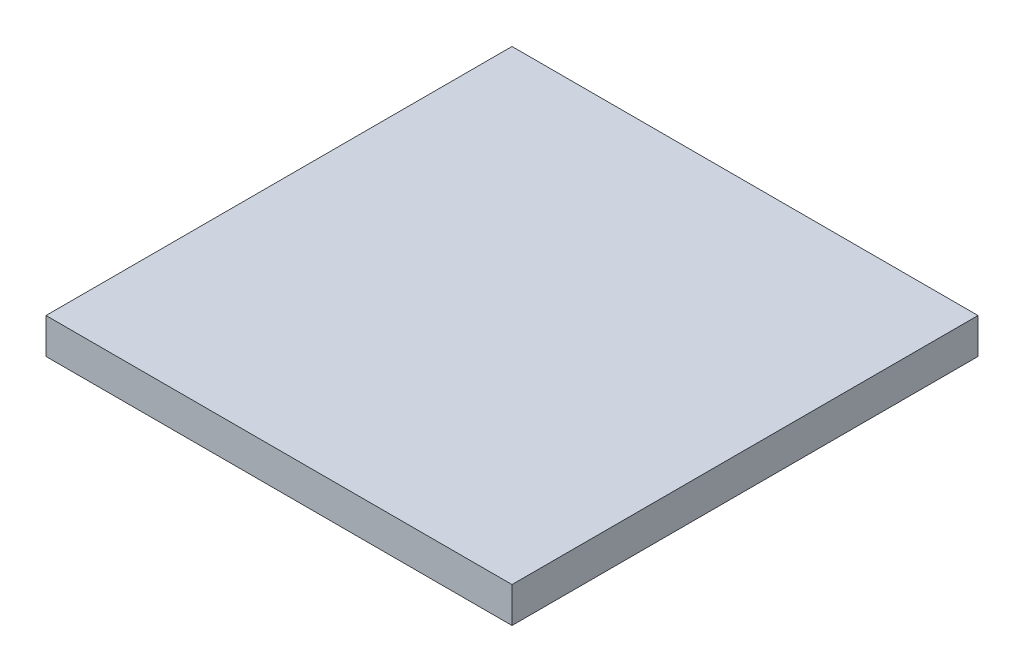
ISO-10303-21;
HEADER;
FILE_DESCRIPTION(('STEP AP214'),'2;1');
FILE_NAME('part.step','',(''),(''),'','','');
FILE_SCHEMA(('AUTOMOTIVE_DESIGN { 1 0 10303 214 1 1 1 1 }'));
ENDSEC;
DATA;
#1=APPLICATION_CONTEXT('core data for automotive mechanical design processes');
#2=APPLICATION_PROTOCOL_DEFINITION('international standard','automotive_design',2000,#1);
#3=PRODUCT_CONTEXT('',#1,'mechanical');
#4=PRODUCT('Part','Part','',(#3));
#5=PRODUCT_RELATED_PRODUCT_CATEGORY('part','',(#4));
#6=PRODUCT_DEFINITION_FORMATION('','',#4);
#7=PRODUCT_DEFINITION_CONTEXT('part definition',#1,'design');
#8=PRODUCT_DEFINITION('design','',#6,#7);
#9=PRODUCT_DEFINITION_SHAPE('','',#8);
#10=(LENGTH_UNIT() NAMED_UNIT(*) SI_UNIT(.MILLI.,.METRE.));
#11=(NAMED_UNIT(*) PLANE_ANGLE_UNIT() SI_UNIT($,.RADIAN.));
#12=(NAMED_UNIT(*) SI_UNIT($,.STERADIAN.) SOLID_ANGLE_UNIT());
#13=UNCERTAINTY_MEASURE_WITH_UNIT(LENGTH_MEASURE(1.E-05),#10,'distance_accuracy_value','');
#14=(GEOMETRIC_REPRESENTATION_CONTEXT(3) GLOBAL_UNCERTAINTY_ASSIGNED_CONTEXT((#13)) GLOBAL_UNIT_ASSIGNED_CONTEXT((#10,
#11,#12)) REPRESENTATION_CONTEXT('',''));
#15=CARTESIAN_POINT('',(0.,0.,0.));
#16=DIRECTION('',(0.,0.,1.));
#17=DIRECTION('',(1.,0.,0.));
#18=AXIS2_PLACEMENT_3D('',#15,#16,#17);
#19=CARTESIAN_POINT('',(-10.5,1.6,-10.5));
#20=DIRECTION('',(1.,0.,0.));
#21=DIRECTION('',(0.,0.,-1.));
#22=AXIS2_PLACEMENT_3D('',#19,#20,#21);
#23=PLANE('',#22);
#24=DIRECTION('',(0.,0.,1.));
#25=VECTOR('',#24,1.);
#26=CARTESIAN_POINT('',(-10.5,0.,-10.5));
#27=LINE('',#26,#25);
#28=CARTESIAN_POINT('',(-10.5,0.,-10.5));
#29=VERTEX_POINT('',#28);
#30=CARTESIAN_POINT('',(-10.5,0.,10.5));
#31=VERTEX_POINT('',#30);
#32=EDGE_CURVE('E96',#29,#31,#27,.T.);
#33=ORIENTED_EDGE('',*,*,#32,.T.);
#34=DIRECTION('',(0.,-1.,0.));
#35=VECTOR('',#34,1.);
#36=CARTESIAN_POINT('',(-10.5,1.6,10.5));
#37=LINE('',#36,#35);
#38=CARTESIAN_POINT('',(-10.5,1.6,10.5));
#39=VERTEX_POINT('',#38);
#40=EDGE_CURVE('E11',#39,#31,#37,.T.);
#41=ORIENTED_EDGE('',*,*,#40,.F.);
#42=DIRECTION('',(0.,0.,1.));
#43=VECTOR('',#42,1.);
#44=CARTESIAN_POINT('',(-10.5,1.6,-10.5));
#45=LINE('',#44,#43);
#46=CARTESIAN_POINT('',(-10.5,1.6,-10.5));
#47=VERTEX_POINT('',#46);
#48=EDGE_CURVE('E84',#47,#39,#45,.T.);
#49=ORIENTED_EDGE('',*,*,#48,.F.);
#50=DIRECTION('',(0.,-1.,0.));
#51=VECTOR('',#50,1.);
#52=CARTESIAN_POINT('',(-10.5,1.6,-10.5));
#53=LINE('',#52,#51);
#54=EDGE_CURVE('E92',#47,#29,#53,.T.);
#55=ORIENTED_EDGE('',*,*,#54,.T.);
#56=EDGE_LOOP('',(#33,#41,#49,#55));
#57=FACE_BOUND('',#56,.T.);
#58=ADVANCED_FACE('F33',(#57),#23,.F.);
#59=CARTESIAN_POINT('',(10.5,1.6,10.5));
#60=DIRECTION('',(0.,0.,-1.));
#61=DIRECTION('',(-1.,0.,0.));
#62=AXIS2_PLACEMENT_3D('',#59,#60,#61);
#63=PLANE('',#62);
#64=DIRECTION('',(1.,0.,0.));
#65=VECTOR('',#64,1.);
#66=CARTESIAN_POINT('',(10.5,0.,10.5));
#67=LINE('',#66,#65);
#68=CARTESIAN_POINT('',(10.5,0.,10.5));
#69=VERTEX_POINT('',#68);
#70=EDGE_CURVE('E88',#31,#69,#67,.T.);
#71=ORIENTED_EDGE('',*,*,#70,.T.);
#72=DIRECTION('',(0.,-1.,0.));
#73=VECTOR('',#72,1.);
#74=CARTESIAN_POINT('',(10.5,1.6,10.5));
#75=LINE('',#74,#73);
#76=CARTESIAN_POINT('',(10.5,1.6,10.5));
#77=VERTEX_POINT('',#76);
#78=EDGE_CURVE('E41',#77,#69,#75,.T.);
#79=ORIENTED_EDGE('',*,*,#78,.F.);
#80=DIRECTION('',(1.,0.,0.));
#81=VECTOR('',#80,1.);
#82=CARTESIAN_POINT('',(10.5,1.6,10.5));
#83=LINE('',#82,#81);
#84=EDGE_CURVE('E79',#39,#77,#83,.T.);
#85=ORIENTED_EDGE('',*,*,#84,.F.);
#86=ORIENTED_EDGE('',*,*,#40,.T.);
#87=EDGE_LOOP('',(#71,#79,#85,#86));
#88=FACE_BOUND('',#87,.T.);
#89=ADVANCED_FACE('F87',(#88),#63,.F.);
#90=CARTESIAN_POINT('',(10.5,1.6,-10.5));
#91=DIRECTION('',(-1.,0.,0.));
#92=DIRECTION('',(0.,0.,1.));
#93=AXIS2_PLACEMENT_3D('',#90,#91,#92);
#94=PLANE('',#93);
#95=DIRECTION('',(0.,0.,-1.));
#96=VECTOR('',#95,1.);
#97=CARTESIAN_POINT('',(10.5,0.,-10.5));
#98=LINE('',#97,#96);
#99=CARTESIAN_POINT('',(10.5,0.,-10.5));
#100=VERTEX_POINT('',#99);
#101=EDGE_CURVE('E66',#69,#100,#98,.T.);
#102=ORIENTED_EDGE('',*,*,#101,.T.);
#103=DIRECTION('',(0.,-1.,0.));
#104=VECTOR('',#103,1.);
#105=CARTESIAN_POINT('',(10.5,1.6,-10.5));
#106=LINE('',#105,#104);
#107=CARTESIAN_POINT('',(10.5,1.6,-10.5));
#108=VERTEX_POINT('',#107);
#109=EDGE_CURVE('E89',#108,#100,#106,.T.);
#110=ORIENTED_EDGE('',*,*,#109,.F.);
#111=DIRECTION('',(0.,0.,-1.));
#112=VECTOR('',#111,1.);
#113=CARTESIAN_POINT('',(10.5,1.6,-10.5));
#114=LINE('',#113,#112);
#115=EDGE_CURVE('E82',#77,#108,#114,.T.);
#116=ORIENTED_EDGE('',*,*,#115,.F.);
#117=ORIENTED_EDGE('',*,*,#78,.T.);
#118=EDGE_LOOP('',(#102,#110,#116,#117));
#119=FACE_BOUND('',#118,.T.);
#120=ADVANCED_FACE('F90',(#119),#94,.F.);
#121=CARTESIAN_POINT('',(10.5,1.6,-10.5));
#122=DIRECTION('',(0.,0.,1.));
#123=DIRECTION('',(1.,0.,0.));
#124=AXIS2_PLACEMENT_3D('',#121,#122,#123);
#125=PLANE('',#124);
#126=DIRECTION('',(-1.,0.,0.));
#127=VECTOR('',#126,1.);
#128=CARTESIAN_POINT('',(10.5,0.,-10.5));
#129=LINE('',#128,#127);
#130=EDGE_CURVE('E72',#100,#29,#129,.T.);
#131=ORIENTED_EDGE('',*,*,#130,.T.);
#132=ORIENTED_EDGE('',*,*,#54,.F.);
#133=DIRECTION('',(-1.,0.,0.));
#134=VECTOR('',#133,1.);
#135=CARTESIAN_POINT('',(10.5,1.6,-10.5));
#136=LINE('',#135,#134);
#137=EDGE_CURVE('E49',#108,#47,#136,.T.);
#138=ORIENTED_EDGE('',*,*,#137,.F.);
#139=ORIENTED_EDGE('',*,*,#109,.T.);
#140=EDGE_LOOP('',(#131,#132,#138,#139));
#141=FACE_BOUND('',#140,.T.);
#142=ADVANCED_FACE('F103',(#141),#125,.F.);
#143=CARTESIAN_POINT('',(0.,1.6,0.));
#144=DIRECTION('',(0.,-1.,0.));
#145=DIRECTION('',(0.,0.,-1.));
#146=AXIS2_PLACEMENT_3D('',#143,#144,#145);
#147=PLANE('',#146);
#148=ORIENTED_EDGE('',*,*,#48,.T.);
#149=ORIENTED_EDGE('',*,*,#84,.T.);
#150=ORIENTED_EDGE('',*,*,#115,.T.);
#151=ORIENTED_EDGE('',*,*,#137,.T.);
#152=EDGE_LOOP('',(#148,#149,#150,#151));
#153=FACE_BOUND('',#152,.T.);
#154=ADVANCED_FACE('F80',(#153),#147,.F.);
#155=CARTESIAN_POINT('',(0.,0.,0.));
#156=DIRECTION('',(0.,-1.,0.));
#157=DIRECTION('',(0.,0.,-1.));
#158=AXIS2_PLACEMENT_3D('',#155,#156,#157);
#159=PLANE('',#158);
#160=ORIENTED_EDGE('',*,*,#32,.F.);
#161=ORIENTED_EDGE('',*,*,#130,.F.);
#162=ORIENTED_EDGE('',*,*,#101,.F.);
#163=ORIENTED_EDGE('',*,*,#70,.F.);
#164=EDGE_LOOP('',(#160,#161,#162,#163));
#165=FACE_BOUND('',#164,.T.);
#166=ADVANCED_FACE('F106',(#165),#159,.T.);
#167=CLOSED_SHELL('',(#58,#89,#120,#142,#154,#166));
#168=MANIFOLD_SOLID_BREP('B2',#167);
#169=ADVANCED_BREP_SHAPE_REPRESENTATION('',(#18,#168),#14);
#170=SHAPE_DEFINITION_REPRESENTATION(#9,#169);
ENDSEC;
END-ISO-10303-21;
